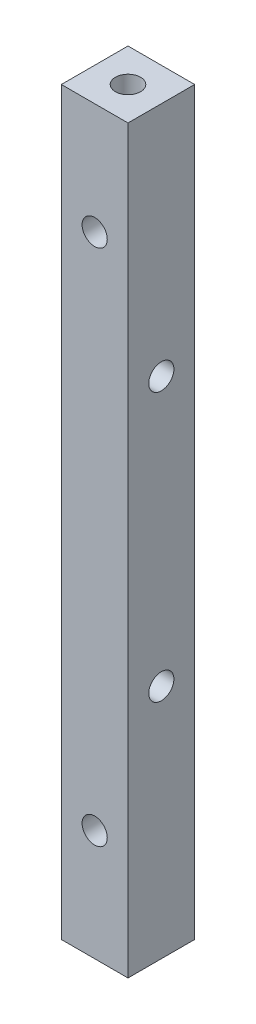
ISO-10303-21;
HEADER;
FILE_DESCRIPTION(('STEP AP214'),'2;1');
FILE_NAME('part.step','',(''),(''),'','','');
FILE_SCHEMA(('AUTOMOTIVE_DESIGN { 1 0 10303 214 1 1 1 1 }'));
ENDSEC;
DATA;
#1=APPLICATION_CONTEXT('core data for automotive mechanical design processes');
#2=APPLICATION_PROTOCOL_DEFINITION('international standard','automotive_design',2000,#1);
#3=PRODUCT_CONTEXT('',#1,'mechanical');
#4=PRODUCT('Part','Part','',(#3));
#5=PRODUCT_RELATED_PRODUCT_CATEGORY('part','',(#4));
#6=PRODUCT_DEFINITION_FORMATION('','',#4);
#7=PRODUCT_DEFINITION_CONTEXT('part definition',#1,'design');
#8=PRODUCT_DEFINITION('design','',#6,#7);
#9=PRODUCT_DEFINITION_SHAPE('','',#8);
#10=(LENGTH_UNIT() NAMED_UNIT(*) SI_UNIT(.MILLI.,.METRE.));
#11=(NAMED_UNIT(*) PLANE_ANGLE_UNIT() SI_UNIT($,.RADIAN.));
#12=(NAMED_UNIT(*) SI_UNIT($,.STERADIAN.) SOLID_ANGLE_UNIT());
#13=UNCERTAINTY_MEASURE_WITH_UNIT(LENGTH_MEASURE(1.E-05),#10,'distance_accuracy_value','');
#14=(GEOMETRIC_REPRESENTATION_CONTEXT(3) GLOBAL_UNCERTAINTY_ASSIGNED_CONTEXT((#13)) GLOBAL_UNIT_ASSIGNED_CONTEXT((#10,
#11,#12)) REPRESENTATION_CONTEXT('',''));
#15=CARTESIAN_POINT('',(0.,0.,0.));
#16=DIRECTION('',(0.,0.,1.));
#17=DIRECTION('',(1.,0.,0.));
#18=AXIS2_PLACEMENT_3D('',#15,#16,#17);
#19=CARTESIAN_POINT('',(4.572,101.6,-4.572));
#20=DIRECTION('',(-1.,0.,0.));
#21=DIRECTION('',(0.,0.,1.));
#22=AXIS2_PLACEMENT_3D('',#19,#20,#21);
#23=PLANE('',#22);
#24=CARTESIAN_POINT('',(4.572,69.215,0.));
#25=DIRECTION('',(1.,0.,0.));
#26=DIRECTION('',(0.,0.,-1.));
#27=AXIS2_PLACEMENT_3D('',#24,#25,#26);
#28=CIRCLE('',#27,1.7272);
#29=CARTESIAN_POINT('',(4.572,69.215,-1.7272));
#30=VERTEX_POINT('',#29);
#31=EDGE_CURVE('E98',#30,#30,#28,.T.);
#32=ORIENTED_EDGE('',*,*,#31,.F.);
#33=EDGE_LOOP('',(#32));
#34=FACE_BOUND('',#33,.T.);
#35=CARTESIAN_POINT('',(4.572,32.385,0.));
#36=DIRECTION('',(1.,0.,0.));
#37=DIRECTION('',(0.,0.,-1.));
#38=AXIS2_PLACEMENT_3D('',#35,#36,#37);
#39=CIRCLE('',#38,1.7272);
#40=CARTESIAN_POINT('',(4.572,32.385,-1.7272));
#41=VERTEX_POINT('',#40);
#42=EDGE_CURVE('E109',#41,#41,#39,.T.);
#43=ORIENTED_EDGE('',*,*,#42,.F.);
#44=EDGE_LOOP('',(#43));
#45=FACE_BOUND('',#44,.T.);
#46=DIRECTION('',(0.,0.,-1.));
#47=VECTOR('',#46,1.);
#48=CARTESIAN_POINT('',(4.572,0.,-4.572));
#49=LINE('',#48,#47);
#50=CARTESIAN_POINT('',(4.572,0.,4.572));
#51=VERTEX_POINT('',#50);
#52=CARTESIAN_POINT('',(4.572,0.,-4.572));
#53=VERTEX_POINT('',#52);
#54=EDGE_CURVE('E127',#51,#53,#49,.T.);
#55=ORIENTED_EDGE('',*,*,#54,.T.);
#56=DIRECTION('',(0.,-1.,0.));
#57=VECTOR('',#56,1.);
#58=CARTESIAN_POINT('',(4.572,101.6,-4.572));
#59=LINE('',#58,#57);
#60=CARTESIAN_POINT('',(4.572,101.6,-4.572));
#61=VERTEX_POINT('',#60);
#62=EDGE_CURVE('E11',#61,#53,#59,.T.);
#63=ORIENTED_EDGE('',*,*,#62,.F.);
#64=DIRECTION('',(0.,0.,-1.));
#65=VECTOR('',#64,1.);
#66=CARTESIAN_POINT('',(4.572,101.6,-4.572));
#67=LINE('',#66,#65);
#68=CARTESIAN_POINT('',(4.572,101.6,4.572));
#69=VERTEX_POINT('',#68);
#70=EDGE_CURVE('E128',#69,#61,#67,.T.);
#71=ORIENTED_EDGE('',*,*,#70,.F.);
#72=DIRECTION('',(0.,-1.,0.));
#73=VECTOR('',#72,1.);
#74=CARTESIAN_POINT('',(4.572,101.6,4.572));
#75=LINE('',#74,#73);
#76=EDGE_CURVE('E134',#69,#51,#75,.T.);
#77=ORIENTED_EDGE('',*,*,#76,.T.);
#78=EDGE_LOOP('',(#55,#63,#71,#77));
#79=FACE_BOUND('',#78,.T.);
#80=ADVANCED_FACE('F37',(#34,#45,#79),#23,.F.);
#81=CARTESIAN_POINT('',(-4.572,101.6,-4.572));
#82=DIRECTION('',(0.,0.,1.));
#83=DIRECTION('',(1.,0.,0.));
#84=AXIS2_PLACEMENT_3D('',#81,#82,#83);
#85=PLANE('',#84);
#86=CARTESIAN_POINT('',(0.,86.36,-4.572));
#87=DIRECTION('',(0.,0.,1.));
#88=DIRECTION('',(1.,0.,0.));
#89=AXIS2_PLACEMENT_3D('',#86,#87,#88);
#90=CIRCLE('',#89,1.7272);
#91=CARTESIAN_POINT('',(1.72719999999999,86.36,-4.572));
#92=VERTEX_POINT('',#91);
#93=EDGE_CURVE('E118',#92,#92,#90,.T.);
#94=ORIENTED_EDGE('',*,*,#93,.T.);
#95=EDGE_LOOP('',(#94));
#96=FACE_BOUND('',#95,.T.);
#97=CARTESIAN_POINT('',(0.,15.24,-4.572));
#98=DIRECTION('',(0.,0.,1.));
#99=DIRECTION('',(1.,0.,0.));
#100=AXIS2_PLACEMENT_3D('',#97,#98,#99);
#101=CIRCLE('',#100,1.7272);
#102=CARTESIAN_POINT('',(1.72720000000001,15.24,-4.572));
#103=VERTEX_POINT('',#102);
#104=EDGE_CURVE('E124',#103,#103,#101,.T.);
#105=ORIENTED_EDGE('',*,*,#104,.T.);
#106=EDGE_LOOP('',(#105));
#107=FACE_BOUND('',#106,.T.);
#108=DIRECTION('',(-1.,0.,0.));
#109=VECTOR('',#108,1.);
#110=CARTESIAN_POINT('',(-4.572,0.,-4.572));
#111=LINE('',#110,#109);
#112=CARTESIAN_POINT('',(-4.572,0.,-4.572));
#113=VERTEX_POINT('',#112);
#114=EDGE_CURVE('E137',#53,#113,#111,.T.);
#115=ORIENTED_EDGE('',*,*,#114,.T.);
#116=DIRECTION('',(0.,-1.,0.));
#117=VECTOR('',#116,1.);
#118=CARTESIAN_POINT('',(-4.572,101.6,-4.572));
#119=LINE('',#118,#117);
#120=CARTESIAN_POINT('',(-4.572,101.6,-4.572));
#121=VERTEX_POINT('',#120);
#122=EDGE_CURVE('E45',#121,#113,#119,.T.);
#123=ORIENTED_EDGE('',*,*,#122,.F.);
#124=DIRECTION('',(-1.,0.,0.));
#125=VECTOR('',#124,1.);
#126=CARTESIAN_POINT('',(-4.572,101.6,-4.572));
#127=LINE('',#126,#125);
#128=EDGE_CURVE('E84',#61,#121,#127,.T.);
#129=ORIENTED_EDGE('',*,*,#128,.F.);
#130=ORIENTED_EDGE('',*,*,#62,.T.);
#131=EDGE_LOOP('',(#115,#123,#129,#130));
#132=FACE_BOUND('',#131,.T.);
#133=ADVANCED_FACE('F162',(#96,#107,#132),#85,.F.);
#134=CARTESIAN_POINT('',(-4.572,101.6,-4.572));
#135=DIRECTION('',(1.,0.,0.));
#136=DIRECTION('',(0.,0.,-1.));
#137=AXIS2_PLACEMENT_3D('',#134,#135,#136);
#138=PLANE('',#137);
#139=CARTESIAN_POINT('',(-4.572,69.215,0.));
#140=DIRECTION('',(1.,0.,0.));
#141=DIRECTION('',(0.,0.,-1.));
#142=AXIS2_PLACEMENT_3D('',#139,#140,#141);
#143=CIRCLE('',#142,1.7272);
#144=CARTESIAN_POINT('',(-4.572,69.215,-1.7272));
#145=VERTEX_POINT('',#144);
#146=EDGE_CURVE('E102',#145,#145,#143,.T.);
#147=ORIENTED_EDGE('',*,*,#146,.T.);
#148=EDGE_LOOP('',(#147));
#149=FACE_BOUND('',#148,.T.);
#150=CARTESIAN_POINT('',(-4.572,32.385,0.));
#151=DIRECTION('',(1.,0.,0.));
#152=DIRECTION('',(0.,0.,-1.));
#153=AXIS2_PLACEMENT_3D('',#150,#151,#152);
#154=CIRCLE('',#153,1.7272);
#155=CARTESIAN_POINT('',(-4.572,32.385,-1.7272));
#156=VERTEX_POINT('',#155);
#157=EDGE_CURVE('E112',#156,#156,#154,.T.);
#158=ORIENTED_EDGE('',*,*,#157,.T.);
#159=EDGE_LOOP('',(#158));
#160=FACE_BOUND('',#159,.T.);
#161=DIRECTION('',(0.,0.,1.));
#162=VECTOR('',#161,1.);
#163=CARTESIAN_POINT('',(-4.572,0.,-4.572));
#164=LINE('',#163,#162);
#165=CARTESIAN_POINT('',(-4.572,0.,4.572));
#166=VERTEX_POINT('',#165);
#167=EDGE_CURVE('E71',#113,#166,#164,.T.);
#168=ORIENTED_EDGE('',*,*,#167,.T.);
#169=DIRECTION('',(0.,-1.,0.));
#170=VECTOR('',#169,1.);
#171=CARTESIAN_POINT('',(-4.572,101.6,4.572));
#172=LINE('',#171,#170);
#173=CARTESIAN_POINT('',(-4.572,101.6,4.572));
#174=VERTEX_POINT('',#173);
#175=EDGE_CURVE('E142',#174,#166,#172,.T.);
#176=ORIENTED_EDGE('',*,*,#175,.F.);
#177=DIRECTION('',(0.,0.,1.));
#178=VECTOR('',#177,1.);
#179=CARTESIAN_POINT('',(-4.572,101.6,-4.572));
#180=LINE('',#179,#178);
#181=EDGE_CURVE('E131',#121,#174,#180,.T.);
#182=ORIENTED_EDGE('',*,*,#181,.F.);
#183=ORIENTED_EDGE('',*,*,#122,.T.);
#184=EDGE_LOOP('',(#168,#176,#182,#183));
#185=FACE_BOUND('',#184,.T.);
#186=ADVANCED_FACE('F144',(#149,#160,#185),#138,.F.);
#187=CARTESIAN_POINT('',(-4.572,101.6,4.572));
#188=DIRECTION('',(0.,0.,-1.));
#189=DIRECTION('',(-1.,0.,0.));
#190=AXIS2_PLACEMENT_3D('',#187,#188,#189);
#191=PLANE('',#190);
#192=CARTESIAN_POINT('',(0.,86.36,4.572));
#193=DIRECTION('',(0.,0.,1.));
#194=DIRECTION('',(1.,0.,0.));
#195=AXIS2_PLACEMENT_3D('',#192,#193,#194);
#196=CIRCLE('',#195,1.7272);
#197=CARTESIAN_POINT('',(1.7272,86.36,4.572));
#198=VERTEX_POINT('',#197);
#199=EDGE_CURVE('E115',#198,#198,#196,.T.);
#200=ORIENTED_EDGE('',*,*,#199,.F.);
#201=EDGE_LOOP('',(#200));
#202=FACE_BOUND('',#201,.T.);
#203=CARTESIAN_POINT('',(0.,15.24,4.572));
#204=DIRECTION('',(0.,0.,1.));
#205=DIRECTION('',(1.,0.,0.));
#206=AXIS2_PLACEMENT_3D('',#203,#204,#205);
#207=CIRCLE('',#206,1.7272);
#208=CARTESIAN_POINT('',(1.72720000000001,15.24,4.572));
#209=VERTEX_POINT('',#208);
#210=EDGE_CURVE('E121',#209,#209,#207,.T.);
#211=ORIENTED_EDGE('',*,*,#210,.F.);
#212=EDGE_LOOP('',(#211));
#213=FACE_BOUND('',#212,.T.);
#214=DIRECTION('',(1.,0.,0.));
#215=VECTOR('',#214,1.);
#216=CARTESIAN_POINT('',(-4.572,0.,4.572));
#217=LINE('',#216,#215);
#218=EDGE_CURVE('E77',#166,#51,#217,.T.);
#219=ORIENTED_EDGE('',*,*,#218,.T.);
#220=ORIENTED_EDGE('',*,*,#76,.F.);
#221=DIRECTION('',(1.,0.,0.));
#222=VECTOR('',#221,1.);
#223=CARTESIAN_POINT('',(-4.572,101.6,4.572));
#224=LINE('',#223,#222);
#225=EDGE_CURVE('E53',#174,#69,#224,.T.);
#226=ORIENTED_EDGE('',*,*,#225,.F.);
#227=ORIENTED_EDGE('',*,*,#175,.T.);
#228=EDGE_LOOP('',(#219,#220,#226,#227));
#229=FACE_BOUND('',#228,.T.);
#230=ADVANCED_FACE('F151',(#202,#213,#229),#191,.F.);
#231=CARTESIAN_POINT('',(0.,101.6,0.));
#232=DIRECTION('',(0.,1.,0.));
#233=DIRECTION('',(0.,0.,1.));
#234=AXIS2_PLACEMENT_3D('',#231,#232,#233);
#235=PLANE('',#234);
#236=CARTESIAN_POINT('',(0.,101.6,0.));
#237=DIRECTION('',(0.,1.,0.));
#238=DIRECTION('',(0.,0.,1.));
#239=AXIS2_PLACEMENT_3D('',#236,#237,#238);
#240=CIRCLE('',#239,1.72719999999999);
#241=CARTESIAN_POINT('',(0.,101.6,1.72719999999999));
#242=VERTEX_POINT('',#241);
#243=EDGE_CURVE('E99',#242,#242,#240,.T.);
#244=ORIENTED_EDGE('',*,*,#243,.F.);
#245=EDGE_LOOP('',(#244));
#246=FACE_BOUND('',#245,.T.);
#247=ORIENTED_EDGE('',*,*,#70,.T.);
#248=ORIENTED_EDGE('',*,*,#128,.T.);
#249=ORIENTED_EDGE('',*,*,#181,.T.);
#250=ORIENTED_EDGE('',*,*,#225,.T.);
#251=EDGE_LOOP('',(#247,#248,#249,#250));
#252=FACE_BOUND('',#251,.T.);
#253=ADVANCED_FACE('F153',(#246,#252),#235,.T.);
#254=CARTESIAN_POINT('',(0.,0.,0.));
#255=DIRECTION('',(0.,1.,0.));
#256=DIRECTION('',(0.,0.,1.));
#257=AXIS2_PLACEMENT_3D('',#254,#255,#256);
#258=PLANE('',#257);
#259=ORIENTED_EDGE('',*,*,#54,.F.);
#260=ORIENTED_EDGE('',*,*,#218,.F.);
#261=ORIENTED_EDGE('',*,*,#167,.F.);
#262=ORIENTED_EDGE('',*,*,#114,.F.);
#263=EDGE_LOOP('',(#259,#260,#261,#262));
#264=FACE_BOUND('',#263,.T.);
#265=ADVANCED_FACE('F147',(#264),#258,.F.);
#266=CARTESIAN_POINT('',(0.,15.24,4.572));
#267=DIRECTION('',(0.,0.,1.));
#268=DIRECTION('',(1.,0.,0.));
#269=AXIS2_PLACEMENT_3D('',#266,#267,#268);
#270=CYLINDRICAL_SURFACE('',#269,1.7272);
#271=ORIENTED_EDGE('',*,*,#104,.F.);
#272=EDGE_LOOP('',(#271));
#273=FACE_BOUND('',#272,.T.);
#274=ORIENTED_EDGE('',*,*,#210,.T.);
#275=EDGE_LOOP('',(#274));
#276=FACE_BOUND('',#275,.T.);
#277=ADVANCED_FACE('F189',(#273,#276),#270,.F.);
#278=CARTESIAN_POINT('',(0.,86.36,4.572));
#279=DIRECTION('',(0.,0.,1.));
#280=DIRECTION('',(1.,0.,0.));
#281=AXIS2_PLACEMENT_3D('',#278,#279,#280);
#282=CYLINDRICAL_SURFACE('',#281,1.7272);
#283=ORIENTED_EDGE('',*,*,#93,.F.);
#284=EDGE_LOOP('',(#283));
#285=FACE_BOUND('',#284,.T.);
#286=ORIENTED_EDGE('',*,*,#199,.T.);
#287=EDGE_LOOP('',(#286));
#288=FACE_BOUND('',#287,.T.);
#289=ADVANCED_FACE('F180',(#285,#288),#282,.F.);
#290=CARTESIAN_POINT('',(4.572,32.385,0.));
#291=DIRECTION('',(1.,0.,0.));
#292=DIRECTION('',(0.,0.,-1.));
#293=AXIS2_PLACEMENT_3D('',#290,#291,#292);
#294=CYLINDRICAL_SURFACE('',#293,1.7272);
#295=ORIENTED_EDGE('',*,*,#157,.F.);
#296=EDGE_LOOP('',(#295));
#297=FACE_BOUND('',#296,.T.);
#298=ORIENTED_EDGE('',*,*,#42,.T.);
#299=EDGE_LOOP('',(#298));
#300=FACE_BOUND('',#299,.T.);
#301=ADVANCED_FACE('F178',(#297,#300),#294,.F.);
#302=CARTESIAN_POINT('',(4.572,69.215,0.));
#303=DIRECTION('',(1.,0.,0.));
#304=DIRECTION('',(0.,0.,-1.));
#305=AXIS2_PLACEMENT_3D('',#302,#303,#304);
#306=CYLINDRICAL_SURFACE('',#305,1.7272);
#307=ORIENTED_EDGE('',*,*,#146,.F.);
#308=EDGE_LOOP('',(#307));
#309=FACE_BOUND('',#308,.T.);
#310=ORIENTED_EDGE('',*,*,#31,.T.);
#311=EDGE_LOOP('',(#310));
#312=FACE_BOUND('',#311,.T.);
#313=ADVANCED_FACE('F92',(#309,#312),#306,.F.);
#314=CARTESIAN_POINT('',(0.,93.98,0.));
#315=DIRECTION('',(0.,1.,0.));
#316=DIRECTION('',(0.,0.,1.));
#317=AXIS2_PLACEMENT_3D('',#314,#315,#316);
#318=CONICAL_SURFACE('',#317,1.7272,1.02974425867665);
#319=CARTESIAN_POINT('',(0.,92.9421935388156,0.));
#320=VERTEX_POINT('',#319);
#321=VERTEX_LOOP('',#320);
#322=FACE_BOUND('',#321,.T.);
#323=CARTESIAN_POINT('',(0.,93.98,0.));
#324=DIRECTION('',(0.,1.,0.));
#325=DIRECTION('',(0.,0.,1.));
#326=AXIS2_PLACEMENT_3D('',#323,#324,#325);
#327=CIRCLE('',#326,1.7272);
#328=CARTESIAN_POINT('',(0.,93.98,1.7272));
#329=VERTEX_POINT('',#328);
#330=EDGE_CURVE('E96',#329,#329,#327,.T.);
#331=ORIENTED_EDGE('',*,*,#330,.T.);
#332=EDGE_LOOP('',(#331));
#333=FACE_BOUND('',#332,.T.);
#334=ADVANCED_FACE('F88',(#322,#333),#318,.F.);
#335=CARTESIAN_POINT('',(0.,101.6,0.));
#336=DIRECTION('',(0.,1.,0.));
#337=DIRECTION('',(0.,0.,1.));
#338=AXIS2_PLACEMENT_3D('',#335,#336,#337);
#339=CYLINDRICAL_SURFACE('',#338,1.72719999999999);
#340=ORIENTED_EDGE('',*,*,#330,.F.);
#341=EDGE_LOOP('',(#340));
#342=FACE_BOUND('',#341,.T.);
#343=ORIENTED_EDGE('',*,*,#243,.T.);
#344=EDGE_LOOP('',(#343));
#345=FACE_BOUND('',#344,.T.);
#346=ADVANCED_FACE('F91',(#342,#345),#339,.F.);
#347=CLOSED_SHELL('',(#80,#133,#186,#230,#253,#265,#277,#289,#301,#313,#334,#346));
#348=MANIFOLD_SOLID_BREP('B2',#347);
#349=ADVANCED_BREP_SHAPE_REPRESENTATION('',(#18,#348),#14);
#350=SHAPE_DEFINITION_REPRESENTATION(#9,#349);
ENDSEC;
END-ISO-10303-21;
